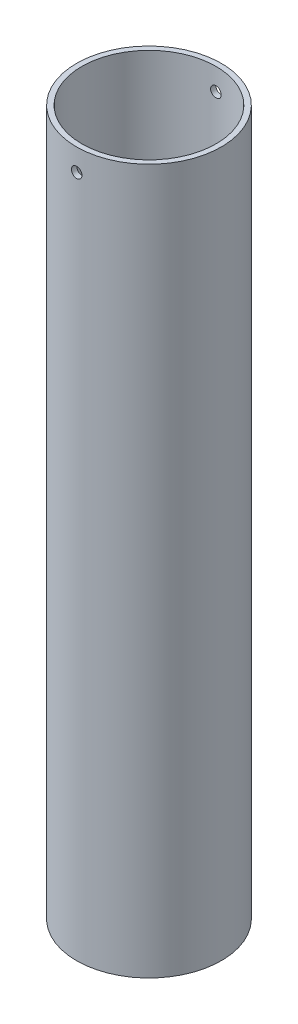
ISO-10303-21;
HEADER;
FILE_DESCRIPTION(('STEP AP214'),'2;1');
FILE_NAME('part.step','',(''),(''),'','','');
FILE_SCHEMA(('AUTOMOTIVE_DESIGN { 1 0 10303 214 1 1 1 1 }'));
ENDSEC;
DATA;
#1=APPLICATION_CONTEXT('core data for automotive mechanical design processes');
#2=APPLICATION_PROTOCOL_DEFINITION('international standard','automotive_design',2000,#1);
#3=PRODUCT_CONTEXT('',#1,'mechanical');
#4=PRODUCT('Part','Part','',(#3));
#5=PRODUCT_RELATED_PRODUCT_CATEGORY('part','',(#4));
#6=PRODUCT_DEFINITION_FORMATION('','',#4);
#7=PRODUCT_DEFINITION_CONTEXT('part definition',#1,'design');
#8=PRODUCT_DEFINITION('design','',#6,#7);
#9=PRODUCT_DEFINITION_SHAPE('','',#8);
#10=(LENGTH_UNIT() NAMED_UNIT(*) SI_UNIT(.MILLI.,.METRE.));
#11=(NAMED_UNIT(*) PLANE_ANGLE_UNIT() SI_UNIT($,.RADIAN.));
#12=(NAMED_UNIT(*) SI_UNIT($,.STERADIAN.) SOLID_ANGLE_UNIT());
#13=UNCERTAINTY_MEASURE_WITH_UNIT(LENGTH_MEASURE(1.E-05),#10,'distance_accuracy_value','');
#14=(GEOMETRIC_REPRESENTATION_CONTEXT(3) GLOBAL_UNCERTAINTY_ASSIGNED_CONTEXT((#13)) GLOBAL_UNIT_ASSIGNED_CONTEXT((#10,
#11,#12)) REPRESENTATION_CONTEXT('',''));
#15=CARTESIAN_POINT('',(0.,0.,0.));
#16=DIRECTION('',(0.,0.,1.));
#17=DIRECTION('',(1.,0.,0.));
#18=AXIS2_PLACEMENT_3D('',#15,#16,#17);
#19=CARTESIAN_POINT('',(0.,200.,0.));
#20=DIRECTION('',(0.,1.,0.));
#21=DIRECTION('',(0.,0.,1.));
#22=AXIS2_PLACEMENT_3D('',#19,#20,#21);
#23=PLANE('',#22);
#24=CARTESIAN_POINT('',(0.,200.,0.));
#25=DIRECTION('',(0.,1.,0.));
#26=DIRECTION('',(0.,0.,1.));
#27=AXIS2_PLACEMENT_3D('',#24,#25,#26);
#28=CIRCLE('',#27,41.1);
#29=CARTESIAN_POINT('',(0.,200.,41.1));
#30=VERTEX_POINT('',#29);
#31=EDGE_CURVE('E10',#30,#30,#28,.T.);
#32=ORIENTED_EDGE('',*,*,#31,.T.);
#33=EDGE_LOOP('',(#32));
#34=FACE_BOUND('',#33,.T.);
#35=CARTESIAN_POINT('',(0.,200.,0.));
#36=DIRECTION('',(0.,1.,0.));
#37=DIRECTION('',(0.,0.,1.));
#38=AXIS2_PLACEMENT_3D('',#35,#36,#37);
#39=CIRCLE('',#38,38.1);
#40=CARTESIAN_POINT('',(0.,200.,38.1));
#41=VERTEX_POINT('',#40);
#42=EDGE_CURVE('E53',#41,#41,#39,.T.);
#43=ORIENTED_EDGE('',*,*,#42,.F.);
#44=EDGE_LOOP('',(#43));
#45=FACE_BOUND('',#44,.T.);
#46=ADVANCED_FACE('F34',(#34,#45),#23,.T.);
#47=CARTESIAN_POINT('',(0.,-200.,0.));
#48=DIRECTION('',(0.,1.,0.));
#49=DIRECTION('',(0.,0.,1.));
#50=AXIS2_PLACEMENT_3D('',#47,#48,#49);
#51=PLANE('',#50);
#52=CARTESIAN_POINT('',(0.,-200.,0.));
#53=DIRECTION('',(0.,1.,0.));
#54=DIRECTION('',(0.,0.,1.));
#55=AXIS2_PLACEMENT_3D('',#52,#53,#54);
#56=CIRCLE('',#55,41.1);
#57=CARTESIAN_POINT('',(0.,-200.,41.1));
#58=VERTEX_POINT('',#57);
#59=EDGE_CURVE('E48',#58,#58,#56,.T.);
#60=ORIENTED_EDGE('',*,*,#59,.F.);
#61=EDGE_LOOP('',(#60));
#62=FACE_BOUND('',#61,.T.);
#63=CARTESIAN_POINT('',(0.,-200.,0.));
#64=DIRECTION('',(0.,1.,0.));
#65=DIRECTION('',(0.,0.,1.));
#66=AXIS2_PLACEMENT_3D('',#63,#64,#65);
#67=CIRCLE('',#66,38.1);
#68=CARTESIAN_POINT('',(0.,-200.,38.1));
#69=VERTEX_POINT('',#68);
#70=EDGE_CURVE('E56',#69,#69,#67,.T.);
#71=ORIENTED_EDGE('',*,*,#70,.T.);
#72=EDGE_LOOP('',(#71));
#73=FACE_BOUND('',#72,.T.);
#74=ADVANCED_FACE('F92',(#62,#73),#51,.F.);
#75=CARTESIAN_POINT('',(0.,200.,0.));
#76=DIRECTION('',(0.,-1.,0.));
#77=DIRECTION('',(0.,0.,-1.));
#78=AXIS2_PLACEMENT_3D('',#75,#76,#77);
#79=CYLINDRICAL_SURFACE('',#78,41.1);
#80=CARTESIAN_POINT('',(0.,190.5,-41.1));
#81=CARTESIAN_POINT('',(-0.168270989542608,190.499992620462,-41.0999985541864));
#82=CARTESIAN_POINT('',(-0.336658272119161,190.485794840473,-41.0989555660221));
#83=CARTESIAN_POINT('',(-0.668778891532126,190.429363332922,-41.0948951546647));
#84=CARTESIAN_POINT('',(-0.832506653192581,190.387097380319,-41.0918754620761));
#85=CARTESIAN_POINT('',(-1.15044967519772,190.275753864509,-41.0842030778659));
#86=CARTESIAN_POINT('',(-1.30467007134262,190.206690926524,-41.0795512771466));
#87=CARTESIAN_POINT('',(-1.5992906674558,190.043738772711,-41.0691371604311));
#88=CARTESIAN_POINT('',(-1.73969392504158,189.94985506654,-41.0633750909668));
#89=CARTESIAN_POINT('',(-2.00301285722284,189.739723381893,-41.0513747783741));
#90=CARTESIAN_POINT('',(-2.12589730781309,189.623436319699,-41.0451357147511));
#91=CARTESIAN_POINT('',(-2.35042286659328,189.371880650994,-41.0328915381733));
#92=CARTESIAN_POINT('',(-2.4520630662132,189.236611233064,-41.0268864352335));
#93=CARTESIAN_POINT('',(-2.63131658346315,188.950746821877,-41.0157808264786));
#94=CARTESIAN_POINT('',(-2.7089031060669,188.800134983923,-41.0106813321636));
#95=CARTESIAN_POINT('',(-2.83767560161694,188.487978789361,-41.0019729638228));
#96=CARTESIAN_POINT('',(-2.88886194352841,188.326434585577,-40.9983640689646));
#97=CARTESIAN_POINT('',(-2.96329217858465,187.99730716541,-40.9930518968675));
#98=CARTESIAN_POINT('',(-2.98658612902434,187.829735325179,-40.9913452062052));
#99=CARTESIAN_POINT('',(-3.00472493543035,187.493052111014,-40.9900196993576));
#100=CARTESIAN_POINT('',(-2.99957021255706,187.323940759908,-40.9904008522632));
#101=CARTESIAN_POINT('',(-2.96099944542258,186.989320968071,-40.9932048831998));
#102=CARTESIAN_POINT('',(-2.9276376762109,186.82380623376,-40.9956238401245));
#103=CARTESIAN_POINT('',(-2.83368408497856,186.500732168932,-41.0022247389992));
#104=CARTESIAN_POINT('',(-2.77309205151527,186.343172900201,-41.006406694639));
#105=CARTESIAN_POINT('',(-2.62633669621374,186.040308568439,-41.0160668668864));
#106=CARTESIAN_POINT('',(-2.54014887997537,185.895015415541,-41.0215463241417));
#107=CARTESIAN_POINT('',(-2.34466621577166,185.620937874039,-41.0331828601395));
#108=CARTESIAN_POINT('',(-2.23537101048214,185.492153740772,-41.0393399493599));
#109=CARTESIAN_POINT('',(-1.99647096830182,185.254434261878,-41.0516553752462));
#110=CARTESIAN_POINT('',(-1.86681918365821,185.145546089971,-41.0578136810873));
#111=CARTESIAN_POINT('',(-1.59105052770613,184.951073743324,-41.0694238048568));
#112=CARTESIAN_POINT('',(-1.44493364845714,184.865489579823,-41.0748756224445));
#113=CARTESIAN_POINT('',(-1.14035294762649,184.720058165684,-41.0844591680234));
#114=CARTESIAN_POINT('',(-0.981888201986474,184.660212843413,-41.0885907970993));
#115=CARTESIAN_POINT('',(-0.657123380966047,184.56799012005,-41.0950671954419));
#116=CARTESIAN_POINT('',(-0.490823430386053,184.535612281608,-41.0974119931593));
#117=CARTESIAN_POINT('',(-0.155517947399587,184.499302390217,-41.1000468665953));
#118=CARTESIAN_POINT('',(0.0134804899730904,184.495305144652,-41.1003416513346));
#119=CARTESIAN_POINT('',(0.34974527837962,184.515699360174,-41.0988558328338));
#120=CARTESIAN_POINT('',(0.517011641753355,184.540090618871,-41.0970752443897));
#121=CARTESIAN_POINT('',(0.844879510440412,184.616515459663,-41.0916420620996));
#122=CARTESIAN_POINT('',(1.00548805791292,184.66851898729,-41.0879915037671));
#123=CARTESIAN_POINT('',(1.31569893527215,184.79866157388,-41.0792287908826));
#124=CARTESIAN_POINT('',(1.46530113070011,184.876800952065,-41.0741166184785));
#125=CARTESIAN_POINT('',(1.74955032240971,185.057162112877,-41.0629927189621));
#126=CARTESIAN_POINT('',(1.88416973152738,185.159427271882,-41.0569793788039));
#127=CARTESIAN_POINT('',(2.13435393089484,185.385074150566,-41.0447347786545));
#128=CARTESIAN_POINT('',(2.24991846674205,185.508456152132,-41.0385035157553));
#129=CARTESIAN_POINT('',(2.45893461515549,185.773116390905,-41.0265115809265));
#130=CARTESIAN_POINT('',(2.5523438170909,185.914428169235,-41.020751825152));
#131=CARTESIAN_POINT('',(2.7141073362787,186.210768837657,-41.0103672229362));
#132=CARTESIAN_POINT('',(2.78246185323971,186.365797618399,-41.0057423674488));
#133=CARTESIAN_POINT('',(2.89210278300433,186.685018907188,-40.9981558091008));
#134=CARTESIAN_POINT('',(2.93341554574963,186.849202324961,-40.9951924876186));
#135=CARTESIAN_POINT('',(2.9878861838198,187.182197743476,-40.9912587459588));
#136=CARTESIAN_POINT('',(3.00104446033219,187.351009678229,-40.9902882973839));
#137=CARTESIAN_POINT('',(2.99882842175657,187.68804863237,-40.9904504490128));
#138=CARTESIAN_POINT('',(2.98352076001887,187.856276096407,-40.9915781364083));
#139=CARTESIAN_POINT('',(2.92494594117118,188.187764726995,-40.995799070581));
#140=CARTESIAN_POINT('',(2.88167873675991,188.351025885144,-40.9988923206835));
#141=CARTESIAN_POINT('',(2.76842899116184,188.667954714778,-41.006694578406));
#142=CARTESIAN_POINT('',(2.69844719412955,188.82162265335,-41.0114035410188));
#143=CARTESIAN_POINT('',(2.53376292940811,189.11503824351,-41.021906627902));
#144=CARTESIAN_POINT('',(2.43906098346895,189.254786188811,-41.0277007292684));
#145=CARTESIAN_POINT('',(2.22737545057415,189.516734877183,-41.0397372161322));
#146=CARTESIAN_POINT('',(2.1103429466012,189.638896044457,-41.0459805666893));
#147=CARTESIAN_POINT('',(1.85739830156931,189.861884930791,-41.05820342762));
#148=CARTESIAN_POINT('',(1.7214815727059,189.962707450695,-41.0641828734129));
#149=CARTESIAN_POINT('',(1.43442231358091,190.140259408154,-41.0752124899895));
#150=CARTESIAN_POINT('',(1.28325686995719,190.216951852634,-41.0802612290762));
#151=CARTESIAN_POINT('',(0.97026466464301,190.343771194139,-41.0888427026007));
#152=CARTESIAN_POINT('',(0.808450528103204,190.393928934858,-41.0923771962701));
#153=CARTESIAN_POINT('',(0.538052220612116,190.453341039007,-41.0966145070351));
#154=CARTESIAN_POINT('',(0.431211914226737,190.470815230554,-41.0978783606582));
#155=CARTESIAN_POINT('',(0.216263751444146,190.494147071285,-41.0995715709719));
#156=CARTESIAN_POINT('',(0.108155897526074,190.500004743186,-41.1000009292943));
#157=CARTESIAN_POINT('',(0.,190.5,-41.1));
#158=B_SPLINE_CURVE_WITH_KNOTS('',3,(#80,#81,#82,#83,#84,#85,#86,#87,#88,#89,#90,#91,#92,#93,
#94,#95,#96,#97,#98,#99,#100,#101,#102,#103,#104,#105,#106,#107,#108,#109,#110,#111,#112,#113,
#114,#115,#116,#117,#118,#119,#120,#121,#122,#123,#124,#125,#126,#127,#128,#129,#130,#131,#132,
#133,#134,#135,#136,#137,#138,#139,#140,#141,#142,#143,#144,#145,#146,#147,#148,#149,#150,#151,
#152,#153,#154,#155,#156,#157),.UNSPECIFIED.,.T.,.F.,(4,2,2,2,2,2,2,2,2,2,2,2,2,2,2,2,2,2,2,2,2,
2,2,2,2,2,2,2,2,2,2,2,2,2,2,2,2,2,4),(0.,0.504418110457893,1.00941634638615,1.51413935187843,
2.01875041403297,2.52424989882672,3.02977099830317,3.53585322529124,4.04192837915431,
4.54709393354447,5.0522520093733,5.55644028333023,6.06063247236972,6.56530872166122,
7.0699927756521,7.5758583427764,8.08172415386242,8.58762785807739,9.0935235068981,
9.5982566936382,10.1029862820102,10.6071676221854,11.111355120654,11.6164561140716,
12.121563850572,12.6276308189294,13.1336937533853,13.6392628345817,14.1448247116205,
14.649204299502,15.153584740683,15.6579511330031,16.1623068808937,16.6677804183772,
17.1733769729263,17.6797449072134,18.1855229435654,18.5097374757251,18.833951373874),.UNSPECIFIED.);
#159=CARTESIAN_POINT('',(0.,190.5,-41.1));
#160=VERTEX_POINT('',#159);
#161=EDGE_CURVE('E81',#160,#160,#158,.T.);
#162=ORIENTED_EDGE('',*,*,#161,.T.);
#163=EDGE_LOOP('',(#162));
#164=FACE_BOUND('',#163,.T.);
#165=CARTESIAN_POINT('',(3.,187.5,40.9903647214806));
#166=CARTESIAN_POINT('',(2.99999261985311,187.331729683809,40.9903661817025));
#167=CARTESIAN_POINT('',(2.98579494964843,187.163343072356,40.9914120243501));
#168=CARTESIAN_POINT('',(2.92936391783301,186.831223847417,40.9954826343363));
#169=CARTESIAN_POINT('',(2.88709832888221,186.667496809633,40.9985096764131));
#170=CARTESIAN_POINT('',(2.77575587696761,186.349555317962,41.0061980071243));
#171=CARTESIAN_POINT('',(2.70669365655271,186.195335722144,41.0108584031068));
#172=CARTESIAN_POINT('',(2.54374319232576,185.90071646582,41.0212872040507));
#173=CARTESIAN_POINT('',(2.44986045639797,185.760313748704,41.0270553631125));
#174=CARTESIAN_POINT('',(2.23972974978125,185.496994201308,41.0390627589025));
#175=CARTESIAN_POINT('',(2.12344247881199,185.374108767397,41.0453028115295));
#176=CARTESIAN_POINT('',(1.87188598035434,185.149581312203,41.0575433664592));
#177=CARTESIAN_POINT('',(1.73661594412085,185.047940196477,41.0635438585417));
#178=CARTESIAN_POINT('',(1.45075099608485,184.868685725099,41.0746366176802));
#179=CARTESIAN_POINT('',(1.3001393458708,184.791098995151,41.0797278756856));
#180=CARTESIAN_POINT('',(0.987983559486846,184.662326064402,41.0884198068339));
#181=CARTESIAN_POINT('',(0.826439575109609,184.611139497126,41.0920205006681));
#182=CARTESIAN_POINT('',(0.497312806784813,184.53670878545,41.0973199259991));
#183=CARTESIAN_POINT('',(0.329741402852981,184.513414565989,41.0990220655879));
#184=CARTESIAN_POINT('',(-0.00694095852117333,184.495275070396,41.1003441112472));
#185=CARTESIAN_POINT('',(-0.17605189329052,184.50042937597,41.0999640479332));
#186=CARTESIAN_POINT('',(-0.510673536762696,184.538999486627,41.0971673390575));
#187=CARTESIAN_POINT('',(-0.676190490004794,184.572361436604,41.0947545744377));
#188=CARTESIAN_POINT('',(-0.999268899509804,184.666316160154,41.0881684438983));
#189=CARTESIAN_POINT('',(-1.15683029517286,184.72690914112,41.0839950645699));
#190=CARTESIAN_POINT('',(-1.45969718886978,184.8736664496,41.0743507318058));
#191=CARTESIAN_POINT('',(-1.60499088493104,184.959855049009,41.0688785477289));
#192=CARTESIAN_POINT('',(-1.87906917978534,185.155339380093,41.0572520410168));
#193=CARTESIAN_POINT('',(-2.00785352291177,185.264635469547,41.0510977078205));
#194=CARTESIAN_POINT('',(-2.24557198739609,185.503536133682,41.0387821292348));
#195=CARTESIAN_POINT('',(-2.35445911400386,185.633187476931,41.0326209011987));
#196=CARTESIAN_POINT('',(-2.54892956269909,185.908954879211,41.02100046625));
#197=CARTESIAN_POINT('',(-2.6345128714249,186.055070947682,41.0155412597399));
#198=CARTESIAN_POINT('',(-2.7799436725956,186.35965143995,41.005941659905));
#199=CARTESIAN_POINT('',(-2.83978897077836,186.518116915221,41.0018013790313));
#200=CARTESIAN_POINT('',(-2.93201142188956,186.842883320523,40.9953102790646));
#201=CARTESIAN_POINT('',(-2.96438901652865,187.009184124507,40.9929594311955));
#202=CARTESIAN_POINT('',(-3.0006979900256,187.344489986834,40.990317747593));
#203=CARTESIAN_POINT('',(-3.00469479220513,187.51348792502,40.9900221740795));
#204=CARTESIAN_POINT('',(-2.98429986813257,187.849751608142,40.9915119845751));
#205=CARTESIAN_POINT('',(-2.959908344249,188.017017365417,40.9932973537499));
#206=CARTESIAN_POINT('',(-2.88348359111006,188.344882308638,40.9987435449062));
#207=CARTESIAN_POINT('',(-2.83148068019891,188.505488598799,41.0024023096718));
#208=CARTESIAN_POINT('',(-2.70134008415022,188.815695234854,41.011181287348));
#209=CARTESIAN_POINT('',(-2.62320207617252,188.965295444766,41.0163015183116));
#210=CARTESIAN_POINT('',(-2.44284291670746,189.249543310838,41.0274379627995));
#211=CARTESIAN_POINT('',(-2.34057804039459,189.384163158614,41.0334557956673));
#212=CARTESIAN_POINT('',(-2.11493147643557,189.634348374959,41.0457037697559));
#213=CARTESIAN_POINT('',(-1.99154950899132,189.749913491015,41.0519339137889));
#214=CARTESIAN_POINT('',(-1.72688901134459,189.958930854477,41.063918483334));
#215=CARTESIAN_POINT('',(-1.58557693506372,190.052340685747,41.0696719828335));
#216=CARTESIAN_POINT('',(-1.28923550660553,190.214105309916,41.0800416711732));
#217=CARTESIAN_POINT('',(-1.13420626382883,190.282460302618,41.0846578690829));
#218=CARTESIAN_POINT('',(-0.814985298143128,190.392101555622,41.0922284939389));
#219=CARTESIAN_POINT('',(-0.650802736459534,190.433414371822,41.0951845507668));
#220=CARTESIAN_POINT('',(-0.317809120320126,190.487885407022,41.0991083841597));
#221=CARTESIAN_POINT('',(-0.148998131104088,190.501044022661,41.1000761887355));
#222=CARTESIAN_POINT('',(0.18804143609542,190.498828956938,41.0999145397637));
#223=CARTESIAN_POINT('',(0.356270455791058,190.483521523055,41.0987899557144));
#224=CARTESIAN_POINT('',(0.687762253622096,190.424946611891,41.0945795804162));
#225=CARTESIAN_POINT('',(0.851025023848045,190.381679090082,41.0914937860438));
#226=CARTESIAN_POINT('',(1.16795702624847,190.268428119641,41.0837075308997));
#227=CARTESIAN_POINT('',(1.32162652327119,190.198445408934,41.0790071147273));
#228=CARTESIAN_POINT('',(1.61504484788572,190.033758835725,41.0685184796013));
#229=CARTESIAN_POINT('',(1.75479397015165,189.939055496676,41.0627302836818));
#230=CARTESIAN_POINT('',(2.01674254609083,189.727368449886,41.0507004845708));
#231=CARTESIAN_POINT('',(2.13890267983112,189.610336142443,41.0444579110906));
#232=CARTESIAN_POINT('',(2.36188957290178,189.357392313152,41.0322310396597));
#233=CARTESIAN_POINT('',(2.46271113039616,189.221476201228,41.0262468049683));
#234=CARTESIAN_POINT('',(2.6402620730678,188.934417426184,41.0152040877625));
#235=CARTESIAN_POINT('',(2.71695428672228,188.783251739396,41.0101470385393));
#236=CARTESIAN_POINT('',(2.84377312894049,188.470259014636,41.0015491441017));
#237=CARTESIAN_POINT('',(2.89393060461593,188.308444603261,40.9980065392425));
#238=CARTESIAN_POINT('',(2.95334194815943,188.0380470072,40.9937589892004));
#239=CARTESIAN_POINT('',(2.97081579766544,187.931207740881,40.992491902736));
#240=CARTESIAN_POINT('',(2.99414718389822,187.716261662702,40.9907943004267));
#241=CARTESIAN_POINT('',(3.00000474355028,187.608154853343,40.9903637829307));
#242=CARTESIAN_POINT('',(3.,187.5,40.9903647214806));
#243=B_SPLINE_CURVE_WITH_KNOTS('',3,(#165,#166,#167,#168,#169,#170,#171,#172,#173,#174,#175,
#176,#177,#178,#179,#180,#181,#182,#183,#184,#185,#186,#187,#188,#189,#190,#191,#192,#193,#194,
#195,#196,#197,#198,#199,#200,#201,#202,#203,#204,#205,#206,#207,#208,#209,#210,#211,#212,#213,
#214,#215,#216,#217,#218,#219,#220,#221,#222,#223,#224,#225,#226,#227,#228,#229,#230,#231,#232,
#233,#234,#235,#236,#237,#238,#239,#240,#241,#242),.UNSPECIFIED.,.T.,.F.,(4,2,2,2,2,2,2,2,2,2,2,
2,2,2,2,2,2,2,2,2,2,2,2,2,2,2,2,2,2,2,2,2,2,2,2,2,2,2,4),(0.,0.50441608808115,1.00941234601392,
1.51413304534268,2.01874183671321,2.52424396749157,3.02976764131442,3.5358488957912,
4.04192312490049,4.54708743147094,5.05224431038356,5.55643889681449,6.06063732326696,
6.56531540768085,7.07000130668026,7.57586422388389,8.08172743113217,8.58763375657528,
9.09353194633845,9.59826356132973,10.1029915783221,10.6071665275719,11.1113477049956,
11.6164497193464,12.1215584267372,12.6276264933997,13.1336905243035,13.639256842798,
14.1448160387667,14.6492001466228,15.1535850577395,15.6579560377837,16.1623163387567,
16.6677871840995,17.1733811096123,17.6797501371964,18.1855292008473,18.5097406062376,
18.8339513717807),.UNSPECIFIED.);
#244=CARTESIAN_POINT('',(3.,187.5,40.9903647214806));
#245=VERTEX_POINT('',#244);
#246=EDGE_CURVE('E76',#245,#245,#243,.T.);
#247=ORIENTED_EDGE('',*,*,#246,.T.);
#248=EDGE_LOOP('',(#247));
#249=FACE_BOUND('',#248,.T.);
#250=ORIENTED_EDGE('',*,*,#31,.F.);
#251=EDGE_LOOP('',(#250));
#252=FACE_BOUND('',#251,.T.);
#253=ORIENTED_EDGE('',*,*,#59,.T.);
#254=EDGE_LOOP('',(#253));
#255=FACE_BOUND('',#254,.T.);
#256=ADVANCED_FACE('F36',(#164,#249,#252,#255),#79,.T.);
#257=CARTESIAN_POINT('',(0.,200.,0.));
#258=DIRECTION('',(0.,-1.,0.));
#259=DIRECTION('',(0.,0.,-1.));
#260=AXIS2_PLACEMENT_3D('',#257,#258,#259);
#261=CYLINDRICAL_SURFACE('',#260,38.1);
#262=CARTESIAN_POINT('',(0.,190.5,-38.1));
#263=CARTESIAN_POINT('',(-0.168231747233971,190.499992638013,-38.099998446912));
#264=CARTESIAN_POINT('',(-0.336578821450959,190.485801451577,-38.0988738634493));
#265=CARTESIAN_POINT('',(-0.668617444154313,190.42939766363,-38.0944957998617));
#266=CARTESIAN_POINT('',(-0.832303460595221,190.387153103035,-38.0912398917405));
#267=CARTESIAN_POINT('',(-1.15016279986592,190.275869724739,-38.0829672096741));
#268=CARTESIAN_POINT('',(-1.30434136095098,190.206845817126,-38.0779514157388));
#269=CARTESIAN_POINT('',(-1.59888649957642,190.043989163037,-38.0667218580813));
#270=CARTESIAN_POINT('',(-1.73925607342919,189.950161814843,-38.0605083551112));
#271=CARTESIAN_POINT('',(-2.00255806729475,189.740128906019,-38.0475649822978));
#272=CARTESIAN_POINT('',(-2.12545450990758,189.623878302403,-38.0408340897933));
#273=CARTESIAN_POINT('',(-2.35001316110074,189.372393600992,-38.0276231652404));
#274=CARTESIAN_POINT('',(-2.45167444831722,189.23715867992,-38.0211431440868));
#275=CARTESIAN_POINT('',(-2.63099682895826,188.951328850632,-38.009156426421));
#276=CARTESIAN_POINT('',(-2.70862661647064,188.800714243896,-38.0036510034827));
#277=CARTESIAN_POINT('',(-2.83748234496727,188.488537902088,-37.9942481478854));
#278=CARTESIAN_POINT('',(-2.88870870740538,188.326976341799,-37.9903506895601));
#279=CARTESIAN_POINT('',(-2.96319990489744,187.997850332942,-37.984613381094));
#280=CARTESIAN_POINT('',(-2.98652296666767,187.830299138748,-37.9827692467758));
#281=CARTESIAN_POINT('',(-3.00472535579016,187.493650762742,-37.9813337466096));
#282=CARTESIAN_POINT('',(-2.99960516500929,187.324553607169,-37.9817423425973));
#283=CARTESIAN_POINT('',(-2.96111455522434,186.990011818941,-37.984762252909));
#284=CARTESIAN_POINT('',(-2.92780734837854,186.824559862728,-37.9873686384266));
#285=CARTESIAN_POINT('',(-2.83398634423376,186.501602198944,-37.9944827044094));
#286=CARTESIAN_POINT('',(-2.7734723062427,186.344096561685,-37.9989904016949));
#287=CARTESIAN_POINT('',(-2.62688439323823,186.041300685609,-38.0094048416245));
#288=CARTESIAN_POINT('',(-2.54078208074953,185.896024269443,-38.0153131393371));
#289=CARTESIAN_POINT('',(-2.34548226976514,185.621961845328,-38.027861575569));
#290=CARTESIAN_POINT('',(-2.23628435443109,185.493176135076,-38.0345017272961));
#291=CARTESIAN_POINT('',(-1.99753816396619,185.255383275023,-38.0477875837013));
#292=CARTESIAN_POINT('',(-1.86793522707672,185.14643099666,-38.0544332541761));
#293=CARTESIAN_POINT('',(-1.59224886896094,184.951821761638,-38.0669640401117));
#294=CARTESIAN_POINT('',(-1.44616543820995,184.866164818442,-38.0728491551329));
#295=CARTESIAN_POINT('',(-1.14162977885254,184.720581454394,-38.0831966712478));
#296=CARTESIAN_POINT('',(-0.98317642500059,184.660657377596,-38.0876589427227));
#297=CARTESIAN_POINT('',(-0.658414826355066,184.568278754839,-38.0946564471868));
#298=CARTESIAN_POINT('',(-0.492106727155889,184.535823699928,-38.0971917158797));
#299=CARTESIAN_POINT('',(-0.156832241885039,184.499372999372,-38.1000449692421));
#300=CARTESIAN_POINT('',(0.0121258541522545,184.495301544124,-38.1003688602206));
#301=CARTESIAN_POINT('',(0.348322302734843,184.515535148184,-38.0987786227159));
#302=CARTESIAN_POINT('',(0.515560669566535,184.539839971569,-38.0968645128399));
#303=CARTESIAN_POINT('',(0.84335485651382,184.616073390099,-38.0910173883829));
#304=CARTESIAN_POINT('',(1.00391887792505,184.66796693375,-38.0870869357889));
#305=CARTESIAN_POINT('',(1.31406037566638,184.797868975807,-38.0776488163083));
#306=CARTESIAN_POINT('',(1.46363769635989,184.875877844072,-38.0721411270841));
#307=CARTESIAN_POINT('',(1.74790537124662,185.055987267232,-38.0601515701749));
#308=CARTESIAN_POINT('',(1.88256375459044,185.158138145059,-38.0536676780261));
#309=CARTESIAN_POINT('',(2.13284858860535,185.383559070906,-38.0404612921669));
#310=CARTESIAN_POINT('',(2.24847474393953,185.50682944659,-38.0337387947559));
#311=CARTESIAN_POINT('',(2.45767217187583,185.771318683426,-38.0207954645973));
#312=CARTESIAN_POINT('',(2.55119404435068,185.91257668124,-38.0145757755781));
#313=CARTESIAN_POINT('',(2.71318964861331,186.208836107424,-38.0033580582585));
#314=CARTESIAN_POINT('',(2.78166360739138,186.363837411234,-37.9983600188872));
#315=CARTESIAN_POINT('',(2.89153516526836,186.683007263889,-37.9901576376703));
#316=CARTESIAN_POINT('',(2.93296321277715,186.847165277194,-37.9869512793302));
#317=CARTESIAN_POINT('',(2.98766616939605,187.180133474229,-37.982688365518));
#318=CARTESIAN_POINT('',(3.00094155477661,187.348943579209,-37.9816317736775));
#319=CARTESIAN_POINT('',(2.99895709645529,187.685933094068,-37.9817884770106));
#320=CARTESIAN_POINT('',(2.98377487949971,187.854112969407,-37.9829955972269));
#321=CARTESIAN_POINT('',(2.92546782765954,188.185526693114,-37.9875305999023));
#322=CARTESIAN_POINT('',(2.88234294790346,188.348760533538,-37.990858485767));
#323=CARTESIAN_POINT('',(2.76939391272223,188.665655128193,-37.9992584404503));
#324=CARTESIAN_POINT('',(2.69957091934791,188.819316298742,-38.0043304333547));
#325=CARTESIAN_POINT('',(2.53521668870739,189.112747598677,-38.0156471958525));
#326=CARTESIAN_POINT('',(2.44068590067045,189.252517980556,-38.0218919441227));
#327=CARTESIAN_POINT('',(2.22930826374457,189.514596923524,-38.0348707691052));
#328=CARTESIAN_POINT('',(2.11240413467862,189.636859224493,-38.0416060737101));
#329=CARTESIAN_POINT('',(1.8596981207468,189.860073471475,-38.0547959677553));
#330=CARTESIAN_POINT('',(1.72389165808317,189.961020240305,-38.0612504886965));
#331=CARTESIAN_POINT('',(1.43700097004189,190.138857985256,-38.073161952752));
#332=CARTESIAN_POINT('',(1.28589107952302,190.215707634104,-38.0786171754514));
#333=CARTESIAN_POINT('',(0.972974545025785,190.342846692265,-38.0878946675525));
#334=CARTESIAN_POINT('',(0.811180498199043,190.393166773621,-38.091718821725));
#335=CARTESIAN_POINT('',(0.540352584154973,190.452938096991,-38.0963165571169));
#336=CARTESIAN_POINT('',(0.43306275197396,190.4705630106,-38.0976915967683));
#337=CARTESIAN_POINT('',(0.217197970993215,190.494096325201,-38.0995338185488));
#338=CARTESIAN_POINT('',(0.108623025183786,190.500004753451,-38.10000100279));
#339=CARTESIAN_POINT('',(0.,190.5,-38.1));
#340=B_SPLINE_CURVE_WITH_KNOTS('',3,(#262,#263,#264,#265,#266,#267,#268,#269,#270,#271,#272,
#273,#274,#275,#276,#277,#278,#279,#280,#281,#282,#283,#284,#285,#286,#287,#288,#289,#290,#291,
#292,#293,#294,#295,#296,#297,#298,#299,#300,#301,#302,#303,#304,#305,#306,#307,#308,#309,#310,
#311,#312,#313,#314,#315,#316,#317,#318,#319,#320,#321,#322,#323,#324,#325,#326,#327,#328,#329,
#330,#331,#332,#333,#334,#335,#336,#337,#338,#339),.UNSPECIFIED.,.T.,.F.,(4,2,2,2,2,2,2,2,2,2,2,
2,2,2,2,2,2,2,2,2,2,2,2,2,2,2,2,2,2,2,2,2,2,2,2,2,2,2,4),(0.,0.504298662431559,1.00917282197076,
1.51376628236042,2.01825001204299,2.52375788652394,3.02928768973423,3.53547330355142,
4.04165083733738,4.5467702614925,5.05188112827278,5.55586222684452,6.0598477840995,
6.56439555264858,7.06895242824792,7.57488467827776,8.08081722070579,8.58679583966797,
9.09276508356318,9.59738241740657,10.1019955558236,10.6059691095434,11.1099498011303,
11.614990430271,12.1200388957557,12.6262056245065,13.1323677661374,13.637959080935,
14.1435418423629,14.6477474800477,15.1519539274089,15.6561384313907,16.1603137690877,
16.6657975935964,17.1714040506964,17.6778729541219,18.1837550145319,18.5093687862973,
18.8349818005477),.UNSPECIFIED.);
#341=CARTESIAN_POINT('',(0.,190.5,-38.1));
#342=VERTEX_POINT('',#341);
#343=EDGE_CURVE('E39',#342,#342,#340,.T.);
#344=ORIENTED_EDGE('',*,*,#343,.F.);
#345=EDGE_LOOP('',(#344));
#346=FACE_BOUND('',#345,.T.);
#347=CARTESIAN_POINT('',(3.,187.5,37.9817061228165));
#348=CARTESIAN_POINT('',(2.99999263719045,187.331769164355,37.9817076939228));
#349=CARTESIAN_POINT('',(2.98580159934802,187.163422998739,37.9828358595202));
#350=CARTESIAN_POINT('',(2.929398455304,186.831386263931,37.9872267211877));
#351=CARTESIAN_POINT('',(2.88715438689889,186.667701227495,37.9904918519464));
#352=CARTESIAN_POINT('',(2.77587244851902,186.349843960122,37.9987845433515));
#353=CARTESIAN_POINT('',(2.7068495120736,186.195666482629,38.0038111215565));
#354=CARTESIAN_POINT('',(2.54399514475642,185.901123158323,38.0150591042465));
#355=CARTESIAN_POINT('',(2.45016910977075,185.76075431656,38.0212802487745));
#356=CARTESIAN_POINT('',(2.24013752525603,185.497451490704,38.0342325269718));
#357=CARTESIAN_POINT('',(2.12388663957137,185.374553717164,38.0409646767242));
#358=CARTESIAN_POINT('',(1.87240081592322,185.149992498787,38.0541710850032));
#359=CARTESIAN_POINT('',(1.73716505830534,185.048329971234,38.0606453323797));
#360=CARTESIAN_POINT('',(1.45133450134774,184.869006297734,38.0726159304312));
#361=CARTESIAN_POINT('',(1.30072014729989,184.79137622874,38.0781110110594));
#362=CARTESIAN_POINT('',(0.988544354849825,184.662519910059,38.087493221072));
#363=CARTESIAN_POINT('',(0.826983089831243,184.611293242289,38.0913803759168));
#364=CARTESIAN_POINT('',(0.497857963443362,184.536801400609,38.0971016693486));
#365=CARTESIAN_POINT('',(0.330307361773934,184.513477975382,38.0989400843701));
#366=CARTESIAN_POINT('',(-0.00633985567438021,184.495274654076,38.1003712317783));
#367=CARTESIAN_POINT('',(-0.175436445425519,184.500394280015,38.0999640019026));
#368=CARTESIAN_POINT('',(-0.509980736989908,184.538884000105,38.096953280766));
#369=CARTESIAN_POINT('',(-0.675435695955886,184.572191450551,38.0943546596273));
#370=CARTESIAN_POINT('',(-0.998399239635831,184.666013984524,38.0872591104424));
#371=CARTESIAN_POINT('',(-1.15590775563613,184.726529303275,38.0827621659843));
#372=CARTESIAN_POINT('',(-1.45870710353401,184.87311985872,38.0723675970522));
#373=CARTESIAN_POINT('',(-1.60398425874548,184.959223232499,38.0664684321079));
#374=CARTESIAN_POINT('',(-1.87804770994827,185.154525303543,38.053932600619));
#375=CARTESIAN_POINT('',(-2.00683370780724,185.263724418245,38.0472959207454));
#376=CARTESIAN_POINT('',(-2.24462519599044,185.502471453755,38.0340099137062));
#377=CARTESIAN_POINT('',(-2.35357605753188,185.632073792904,38.0273606010956));
#378=CARTESIAN_POINT('',(-2.54818271957317,185.907758452337,38.014816911902));
#379=CARTESIAN_POINT('',(-2.63383850372185,186.053840784187,38.0089225358489));
#380=CARTESIAN_POINT('',(-2.77942103611411,186.358376157954,37.9985548671025));
#381=CARTESIAN_POINT('',(-2.83934508026097,186.516830497953,37.9940817237766));
#382=CARTESIAN_POINT('',(-2.93172333498932,186.841594238299,37.987065736564));
#383=CARTESIAN_POINT('',(-2.96417806043199,187.007903491359,37.9845228564983));
#384=CARTESIAN_POINT('',(-3.00062752011217,187.343178494121,37.9816610304906));
#385=CARTESIAN_POINT('',(-3.00469837523441,187.512135919726,37.9813361363233));
#386=CARTESIAN_POINT('',(-2.98446381026819,187.84833088284,37.9829313607363));
#387=CARTESIAN_POINT('',(-2.96015862608406,188.015568434635,37.9848514606528));
#388=CARTESIAN_POINT('',(-2.88392532112056,188.343358665052,37.9907148936824));
#389=CARTESIAN_POINT('',(-2.83203260991999,188.503919629111,37.9946556330027));
#390=CARTESIAN_POINT('',(-2.70213325791825,188.814055380953,38.0041141477173));
#391=CARTESIAN_POINT('',(-2.62412624236912,188.963630011042,38.0096319457427));
#392=CARTESIAN_POINT('',(-2.4440195294154,189.247895882265,38.0216372685861));
#393=CARTESIAN_POINT('',(-2.34186903801058,189.382554853887,38.0281268271381));
#394=CARTESIAN_POINT('',(-2.11644854759189,189.632841055103,38.0413375086004));
#395=CARTESIAN_POINT('',(-1.99317822372542,189.748467991905,38.0480586350712));
#396=CARTESIAN_POINT('',(-1.72868863963983,189.957667066372,38.0609927779403));
#397=CARTESIAN_POINT('',(-1.58743023476543,190.051189795024,38.0672046361296));
#398=CARTESIAN_POINT('',(-1.2911697701626,190.21318690233,38.0784036549712));
#399=CARTESIAN_POINT('',(-1.13616783507938,190.281661508128,38.0833908267291));
#400=CARTESIAN_POINT('',(-0.816998415118378,190.391533503235,38.0915731816661));
#401=CARTESIAN_POINT('',(-0.652841562568325,190.432961621127,38.0947703978937));
#402=CARTESIAN_POINT('',(-0.319875810177813,190.487665111981,38.0990208249773));
#403=CARTESIAN_POINT('',(-0.151066988065343,190.50094095504,38.1000740716341));
#404=CARTESIAN_POINT('',(0.185923345987406,190.498957814005,38.0999179574426));
#405=CARTESIAN_POINT('',(0.354105319738756,190.483775907986,38.0987147083298));
#406=CARTESIAN_POINT('',(0.685523316862961,190.425468739002,38.0941929163251));
#407=CARTESIAN_POINT('',(0.848759332954141,190.382343434899,38.0908743703191));
#408=CARTESIAN_POINT('',(1.16565822503217,190.269392749855,38.0824944793006));
#409=CARTESIAN_POINT('',(1.31932151351378,190.199568520314,38.0774332094446));
#410=CARTESIAN_POINT('',(1.61275653219392,190.035211163099,38.066134597343));
#411=CARTESIAN_POINT('',(1.75252851619428,189.940678486975,38.0598972765906));
#412=CARTESIAN_POINT('',(2.01460731826158,189.729298793283,38.0469269107626));
#413=CARTESIAN_POINT('',(2.13686822247435,189.612394925961,38.0401926301903));
#414=CARTESIAN_POINT('',(2.3600797738311,189.35969000744,38.026997792086));
#415=CARTESIAN_POINT('',(2.46102524016343,189.223884375362,38.0205373014041));
#416=CARTESIAN_POINT('',(2.63886160612244,188.936994343978,38.008609440285));
#417=CARTESIAN_POINT('',(2.71571093847919,188.785884130832,38.0031437927491));
#418=CARTESIAN_POINT('',(2.8428493151607,188.472966908005,37.9938456742818));
#419=CARTESIAN_POINT('',(2.89316903613437,188.311172497431,37.9900113180553));
#420=CARTESIAN_POINT('',(2.95293932899368,188.040345550156,37.9854006674839));
#421=CARTESIAN_POINT('',(2.97056377907317,187.93305712139,37.9840215382606));
#422=CARTESIAN_POINT('',(2.99409647777375,187.717195153032,37.9821737597893));
#423=CARTESIAN_POINT('',(3.00000475394581,187.608621616463,37.9817051084003));
#424=CARTESIAN_POINT('',(3.,187.5,37.9817061228165));
#425=B_SPLINE_CURVE_WITH_KNOTS('',3,(#347,#348,#349,#350,#351,#352,#353,#354,#355,#356,#357,
#358,#359,#360,#361,#362,#363,#364,#365,#366,#367,#368,#369,#370,#371,#372,#373,#374,#375,#376,
#377,#378,#379,#380,#381,#382,#383,#384,#385,#386,#387,#388,#389,#390,#391,#392,#393,#394,#395,
#396,#397,#398,#399,#400,#401,#402,#403,#404,#405,#406,#407,#408,#409,#410,#411,#412,#413,#414,
#415,#416,#417,#418,#419,#420,#421,#422,#423,#424),.UNSPECIFIED.,.T.,.F.,(4,2,2,2,2,2,2,2,2,2,2,
2,2,2,2,2,2,2,2,2,2,2,2,2,2,2,2,2,2,2,2,2,2,2,2,2,2,2,4),(0.,0.504295924465317,1.00916740624703,
1.51375774466711,2.01823840023757,2.52374985710117,3.02928314567327,3.53546744698397,
4.0416437329223,4.54676146177969,5.05187070224333,5.55586034323923,6.05985434153633,
6.56440460437072,7.06896398733682,7.57489264281388,8.08082165340911,8.58680381806124,
9.09277649881081,9.59739172008931,10.1020027462767,10.605967644369,11.1099397748163,
11.6149817707415,12.1200315356173,12.6261997696088,13.1323634134408,13.6379509793532,
14.1435301027112,14.6477418386723,15.151954316922,15.6561450532941,16.1603265761283,
16.6658067621936,17.1714096663998,17.6778800273773,18.1837634562952,18.5093730099339,
18.8349817978902),.UNSPECIFIED.);
#426=CARTESIAN_POINT('',(3.,187.5,37.9817061228165));
#427=VERTEX_POINT('',#426);
#428=EDGE_CURVE('E58',#427,#427,#425,.T.);
#429=ORIENTED_EDGE('',*,*,#428,.F.);
#430=EDGE_LOOP('',(#429));
#431=FACE_BOUND('',#430,.T.);
#432=ORIENTED_EDGE('',*,*,#42,.T.);
#433=EDGE_LOOP('',(#432));
#434=FACE_BOUND('',#433,.T.);
#435=ORIENTED_EDGE('',*,*,#70,.F.);
#436=EDGE_LOOP('',(#435));
#437=FACE_BOUND('',#436,.T.);
#438=ADVANCED_FACE('F63',(#346,#431,#434,#437),#261,.F.);
#439=CARTESIAN_POINT('',(0.,187.5,-41.1));
#440=DIRECTION('',(0.,0.,1.));
#441=DIRECTION('',(1.,0.,0.));
#442=AXIS2_PLACEMENT_3D('',#439,#440,#441);
#443=CYLINDRICAL_SURFACE('',#442,3.);
#444=ORIENTED_EDGE('',*,*,#428,.T.);
#445=EDGE_LOOP('',(#444));
#446=FACE_BOUND('',#445,.T.);
#447=ORIENTED_EDGE('',*,*,#246,.F.);
#448=EDGE_LOOP('',(#447));
#449=FACE_BOUND('',#448,.T.);
#450=ADVANCED_FACE('F69',(#446,#449),#443,.F.);
#451=ORIENTED_EDGE('',*,*,#343,.T.);
#452=EDGE_LOOP('',(#451));
#453=FACE_BOUND('',#452,.T.);
#454=ORIENTED_EDGE('',*,*,#161,.F.);
#455=EDGE_LOOP('',(#454));
#456=FACE_BOUND('',#455,.T.);
#457=ADVANCED_FACE('F66',(#453,#456),#443,.F.);
#458=CLOSED_SHELL('',(#46,#74,#256,#438,#450,#457));
#459=MANIFOLD_SOLID_BREP('B2',#458);
#460=ADVANCED_BREP_SHAPE_REPRESENTATION('',(#18,#459),#14);
#461=SHAPE_DEFINITION_REPRESENTATION(#9,#460);
ENDSEC;
END-ISO-10303-21;
